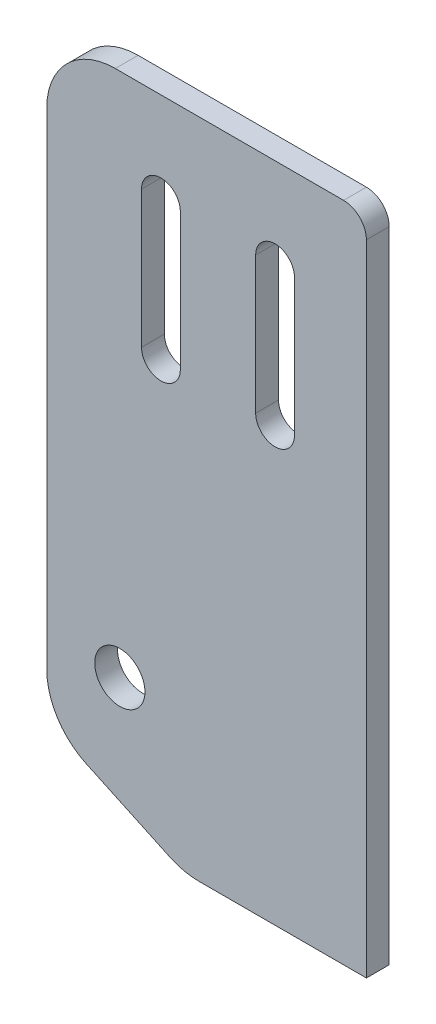
ISO-10303-21;
HEADER;
FILE_DESCRIPTION(('STEP AP214'),'2;1');
FILE_NAME('part.step','',(''),(''),'','','');
FILE_SCHEMA(('AUTOMOTIVE_DESIGN { 1 0 10303 214 1 1 1 1 }'));
ENDSEC;
DATA;
#1=APPLICATION_CONTEXT('core data for automotive mechanical design processes');
#2=APPLICATION_PROTOCOL_DEFINITION('international standard','automotive_design',2000,#1);
#3=PRODUCT_CONTEXT('',#1,'mechanical');
#4=PRODUCT('Part','Part','',(#3));
#5=PRODUCT_RELATED_PRODUCT_CATEGORY('part','',(#4));
#6=PRODUCT_DEFINITION_FORMATION('','',#4);
#7=PRODUCT_DEFINITION_CONTEXT('part definition',#1,'design');
#8=PRODUCT_DEFINITION('design','',#6,#7);
#9=PRODUCT_DEFINITION_SHAPE('','',#8);
#10=(LENGTH_UNIT() NAMED_UNIT(*) SI_UNIT(.MILLI.,.METRE.));
#11=(NAMED_UNIT(*) PLANE_ANGLE_UNIT() SI_UNIT($,.RADIAN.));
#12=(NAMED_UNIT(*) SI_UNIT($,.STERADIAN.) SOLID_ANGLE_UNIT());
#13=UNCERTAINTY_MEASURE_WITH_UNIT(LENGTH_MEASURE(1.E-05),#10,'distance_accuracy_value','');
#14=(GEOMETRIC_REPRESENTATION_CONTEXT(3) GLOBAL_UNCERTAINTY_ASSIGNED_CONTEXT((#13)) GLOBAL_UNIT_ASSIGNED_CONTEXT((#10,
#11,#12)) REPRESENTATION_CONTEXT('',''));
#15=CARTESIAN_POINT('',(0.,0.,0.));
#16=DIRECTION('',(0.,0.,1.));
#17=DIRECTION('',(1.,0.,0.));
#18=AXIS2_PLACEMENT_3D('',#15,#16,#17);
#19=CARTESIAN_POINT('',(0.,-145.,-5.));
#20=DIRECTION('',(-1.,0.,0.));
#21=DIRECTION('',(0.,0.,1.));
#22=AXIS2_PLACEMENT_3D('',#19,#20,#21);
#23=PLANE('',#22);
#24=DIRECTION('',(0.,-1.,0.));
#25=VECTOR('',#24,1.);
#26=CARTESIAN_POINT('',(0.,-145.,-5.));
#27=LINE('',#26,#25);
#28=CARTESIAN_POINT('',(0.,-15.,-5.));
#29=VERTEX_POINT('',#28);
#30=CARTESIAN_POINT('',(0.,-121.454716343238,-5.));
#31=VERTEX_POINT('',#30);
#32=EDGE_CURVE('E238',#29,#31,#27,.T.);
#33=ORIENTED_EDGE('',*,*,#32,.T.);
#34=DIRECTION('',(0.,0.,-1.));
#35=VECTOR('',#34,1.);
#36=CARTESIAN_POINT('',(0.,-121.454716343238,-5.));
#37=LINE('',#36,#35);
#38=CARTESIAN_POINT('',(0.,-121.454716343238,0.));
#39=VERTEX_POINT('',#38);
#40=EDGE_CURVE('E287',#31,#39,#37,.F.);
#41=ORIENTED_EDGE('',*,*,#40,.T.);
#42=DIRECTION('',(0.,-1.,0.));
#43=VECTOR('',#42,1.);
#44=CARTESIAN_POINT('',(0.,-145.,0.));
#45=LINE('',#44,#43);
#46=CARTESIAN_POINT('',(0.,-15.,0.));
#47=VERTEX_POINT('',#46);
#48=EDGE_CURVE('E237',#47,#39,#45,.T.);
#49=ORIENTED_EDGE('',*,*,#48,.F.);
#50=DIRECTION('',(0.,0.,1.));
#51=VECTOR('',#50,1.);
#52=CARTESIAN_POINT('',(0.,-15.,-5.));
#53=LINE('',#52,#51);
#54=EDGE_CURVE('E285',#47,#29,#53,.F.);
#55=ORIENTED_EDGE('',*,*,#54,.T.);
#56=EDGE_LOOP('',(#33,#41,#49,#55));
#57=FACE_BOUND('',#56,.T.);
#58=ADVANCED_FACE('F45',(#57),#23,.T.);
#59=CARTESIAN_POINT('',(0.,0.,-5.));
#60=DIRECTION('',(0.,1.,0.));
#61=DIRECTION('',(0.,0.,1.));
#62=AXIS2_PLACEMENT_3D('',#59,#60,#61);
#63=PLANE('',#62);
#64=DIRECTION('',(-1.,0.,0.));
#65=VECTOR('',#64,1.);
#66=CARTESIAN_POINT('',(0.,0.,0.));
#67=LINE('',#66,#65);
#68=CARTESIAN_POINT('',(65.,0.,0.));
#69=VERTEX_POINT('',#68);
#70=CARTESIAN_POINT('',(15.,0.,0.));
#71=VERTEX_POINT('',#70);
#72=EDGE_CURVE('E242',#69,#71,#67,.T.);
#73=ORIENTED_EDGE('',*,*,#72,.F.);
#74=DIRECTION('',(0.,0.,1.));
#75=VECTOR('',#74,1.);
#76=CARTESIAN_POINT('',(65.,0.,-5.));
#77=LINE('',#76,#75);
#78=CARTESIAN_POINT('',(65.,0.,-5.));
#79=VERTEX_POINT('',#78);
#80=EDGE_CURVE('E53',#69,#79,#77,.F.);
#81=ORIENTED_EDGE('',*,*,#80,.T.);
#82=DIRECTION('',(-1.,0.,0.));
#83=VECTOR('',#82,1.);
#84=CARTESIAN_POINT('',(0.,0.,-5.));
#85=LINE('',#84,#83);
#86=CARTESIAN_POINT('',(15.,0.,-5.));
#87=VERTEX_POINT('',#86);
#88=EDGE_CURVE('E247',#79,#87,#85,.T.);
#89=ORIENTED_EDGE('',*,*,#88,.T.);
#90=DIRECTION('',(0.,0.,1.));
#91=VECTOR('',#90,1.);
#92=CARTESIAN_POINT('',(15.,0.,-5.));
#93=LINE('',#92,#91);
#94=EDGE_CURVE('E290',#87,#71,#93,.T.);
#95=ORIENTED_EDGE('',*,*,#94,.T.);
#96=EDGE_LOOP('',(#73,#81,#89,#95));
#97=FACE_BOUND('',#96,.T.);
#98=ADVANCED_FACE('F320',(#97),#63,.T.);
#99=CARTESIAN_POINT('',(70.,0.,-5.));
#100=DIRECTION('',(1.,0.,0.));
#101=DIRECTION('',(0.,1.,0.));
#102=AXIS2_PLACEMENT_3D('',#99,#100,#101);
#103=PLANE('',#102);
#104=DIRECTION('',(0.,1.,0.));
#105=VECTOR('',#104,1.);
#106=CARTESIAN_POINT('',(70.,0.,-5.));
#107=LINE('',#106,#105);
#108=CARTESIAN_POINT('',(70.,-145.,-5.));
#109=VERTEX_POINT('',#108);
#110=CARTESIAN_POINT('',(70.,-5.,-5.));
#111=VERTEX_POINT('',#110);
#112=EDGE_CURVE('E244',#109,#111,#107,.T.);
#113=ORIENTED_EDGE('',*,*,#112,.T.);
#114=DIRECTION('',(0.,0.,1.));
#115=VECTOR('',#114,1.);
#116=CARTESIAN_POINT('',(70.,-5.,-5.));
#117=LINE('',#116,#115);
#118=CARTESIAN_POINT('',(70.,-5.,0.));
#119=VERTEX_POINT('',#118);
#120=EDGE_CURVE('E293',#111,#119,#117,.T.);
#121=ORIENTED_EDGE('',*,*,#120,.T.);
#122=DIRECTION('',(0.,1.,0.));
#123=VECTOR('',#122,1.);
#124=CARTESIAN_POINT('',(70.,0.,0.));
#125=LINE('',#124,#123);
#126=CARTESIAN_POINT('',(70.,-145.,0.));
#127=VERTEX_POINT('',#126);
#128=EDGE_CURVE('E254',#127,#119,#125,.T.);
#129=ORIENTED_EDGE('',*,*,#128,.F.);
#130=DIRECTION('',(0.,0.,1.));
#131=VECTOR('',#130,1.);
#132=CARTESIAN_POINT('',(70.,-145.,-5.));
#133=LINE('',#132,#131);
#134=EDGE_CURVE('E249',#109,#127,#133,.T.);
#135=ORIENTED_EDGE('',*,*,#134,.F.);
#136=EDGE_LOOP('',(#113,#121,#129,#135));
#137=FACE_BOUND('',#136,.T.);
#138=ADVANCED_FACE('F299',(#137),#103,.T.);
#139=CARTESIAN_POINT('',(70.,-145.,-5.));
#140=DIRECTION('',(0.,-1.,0.));
#141=DIRECTION('',(0.,0.,-1.));
#142=AXIS2_PLACEMENT_3D('',#139,#140,#141);
#143=PLANE('',#142);
#144=DIRECTION('',(1.,0.,0.));
#145=VECTOR('',#144,1.);
#146=CARTESIAN_POINT('',(70.,-145.,0.));
#147=LINE('',#146,#145);
#148=CARTESIAN_POINT('',(33.3254199396444,-145.,0.));
#149=VERTEX_POINT('',#148);
#150=EDGE_CURVE('E252',#149,#127,#147,.T.);
#151=ORIENTED_EDGE('',*,*,#150,.F.);
#152=DIRECTION('',(0.,0.,1.));
#153=VECTOR('',#152,1.);
#154=CARTESIAN_POINT('',(33.3254199396444,-145.,-5.));
#155=LINE('',#154,#153);
#156=CARTESIAN_POINT('',(33.3254199396444,-145.,-5.));
#157=VERTEX_POINT('',#156);
#158=EDGE_CURVE('E265',#149,#157,#155,.F.);
#159=ORIENTED_EDGE('',*,*,#158,.T.);
#160=DIRECTION('',(1.,0.,0.));
#161=VECTOR('',#160,1.);
#162=CARTESIAN_POINT('',(70.,-145.,-5.));
#163=LINE('',#162,#161);
#164=EDGE_CURVE('E241',#157,#109,#163,.T.);
#165=ORIENTED_EDGE('',*,*,#164,.T.);
#166=ORIENTED_EDGE('',*,*,#134,.T.);
#167=EDGE_LOOP('',(#151,#159,#165,#166));
#168=FACE_BOUND('',#167,.T.);
#169=ADVANCED_FACE('F308',(#168),#143,.T.);
#170=CARTESIAN_POINT('',(0.,0.,-5.));
#171=DIRECTION('',(0.,0.,-1.));
#172=DIRECTION('',(-1.,0.,0.));
#173=AXIS2_PLACEMENT_3D('',#170,#171,#172);
#174=PLANE('',#173);
#175=CARTESIAN_POINT('',(16.,-115.,-5.));
#176=DIRECTION('',(0.,0.,-1.));
#177=DIRECTION('',(-1.,0.,0.));
#178=AXIS2_PLACEMENT_3D('',#175,#176,#177);
#179=CIRCLE('',#178,5.5);
#180=CARTESIAN_POINT('',(10.5,-115.,-5.));
#181=VERTEX_POINT('',#180);
#182=EDGE_CURVE('E234',#181,#181,#179,.T.);
#183=ORIENTED_EDGE('',*,*,#182,.F.);
#184=EDGE_LOOP('',(#183));
#185=FACE_BOUND('',#184,.T.);
#186=CARTESIAN_POINT('',(50.,-20.,-5.));
#187=DIRECTION('',(0.,0.,-1.));
#188=DIRECTION('',(-1.,0.,0.));
#189=AXIS2_PLACEMENT_3D('',#186,#187,#188);
#190=CIRCLE('',#189,4.25000000000001);
#191=CARTESIAN_POINT('',(45.75,-20.,-5.));
#192=VERTEX_POINT('',#191);
#193=CARTESIAN_POINT('',(54.25,-20.,-5.));
#194=VERTEX_POINT('',#193);
#195=EDGE_CURVE('E232',#192,#194,#190,.T.);
#196=ORIENTED_EDGE('',*,*,#195,.F.);
#197=DIRECTION('',(0.,1.,0.));
#198=VECTOR('',#197,1.);
#199=CARTESIAN_POINT('',(45.75,0.,-5.));
#200=LINE('',#199,#198);
#201=CARTESIAN_POINT('',(45.75,-50.,-5.));
#202=VERTEX_POINT('',#201);
#203=EDGE_CURVE('E227',#202,#192,#200,.T.);
#204=ORIENTED_EDGE('',*,*,#203,.F.);
#205=CARTESIAN_POINT('',(50.,-50.,-5.));
#206=DIRECTION('',(0.,0.,-1.));
#207=DIRECTION('',(-1.,0.,0.));
#208=AXIS2_PLACEMENT_3D('',#205,#206,#207);
#209=CIRCLE('',#208,4.25000000000001);
#210=CARTESIAN_POINT('',(54.25,-50.,-5.));
#211=VERTEX_POINT('',#210);
#212=EDGE_CURVE('E170',#211,#202,#209,.T.);
#213=ORIENTED_EDGE('',*,*,#212,.F.);
#214=DIRECTION('',(0.,-1.,0.));
#215=VECTOR('',#214,1.);
#216=CARTESIAN_POINT('',(54.25,0.,-5.));
#217=LINE('',#216,#215);
#218=EDGE_CURVE('E230',#194,#211,#217,.T.);
#219=ORIENTED_EDGE('',*,*,#218,.F.);
#220=EDGE_LOOP('',(#196,#204,#213,#219));
#221=FACE_BOUND('',#220,.T.);
#222=CARTESIAN_POINT('',(25.,-20.,-5.));
#223=DIRECTION('',(0.,0.,-1.));
#224=DIRECTION('',(-1.,0.,0.));
#225=AXIS2_PLACEMENT_3D('',#222,#223,#224);
#226=CIRCLE('',#225,4.25000000000001);
#227=CARTESIAN_POINT('',(20.75,-20.,-5.));
#228=VERTEX_POINT('',#227);
#229=CARTESIAN_POINT('',(29.25,-20.,-5.));
#230=VERTEX_POINT('',#229);
#231=EDGE_CURVE('E225',#228,#230,#226,.T.);
#232=ORIENTED_EDGE('',*,*,#231,.F.);
#233=DIRECTION('',(0.,1.,0.));
#234=VECTOR('',#233,1.);
#235=CARTESIAN_POINT('',(20.75,0.,-5.));
#236=LINE('',#235,#234);
#237=CARTESIAN_POINT('',(20.75,-50.,-5.));
#238=VERTEX_POINT('',#237);
#239=EDGE_CURVE('E218',#238,#228,#236,.T.);
#240=ORIENTED_EDGE('',*,*,#239,.F.);
#241=CARTESIAN_POINT('',(25.,-50.,-5.));
#242=DIRECTION('',(0.,0.,-1.));
#243=DIRECTION('',(-1.,0.,0.));
#244=AXIS2_PLACEMENT_3D('',#241,#242,#243);
#245=CIRCLE('',#244,4.25000000000001);
#246=CARTESIAN_POINT('',(29.25,-50.,-5.));
#247=VERTEX_POINT('',#246);
#248=EDGE_CURVE('E220',#247,#238,#245,.T.);
#249=ORIENTED_EDGE('',*,*,#248,.F.);
#250=DIRECTION('',(0.,-1.,0.));
#251=VECTOR('',#250,1.);
#252=CARTESIAN_POINT('',(29.25,0.,-5.));
#253=LINE('',#252,#251);
#254=EDGE_CURVE('E223',#230,#247,#253,.T.);
#255=ORIENTED_EDGE('',*,*,#254,.F.);
#256=EDGE_LOOP('',(#232,#240,#249,#255));
#257=FACE_BOUND('',#256,.T.);
#258=ORIENTED_EDGE('',*,*,#88,.F.);
#259=CARTESIAN_POINT('',(65.,-5.,-5.));
#260=DIRECTION('',(0.,0.,-1.));
#261=DIRECTION('',(-1.,0.,0.));
#262=AXIS2_PLACEMENT_3D('',#259,#260,#261);
#263=CIRCLE('',#262,5.);
#264=EDGE_CURVE('E11',#79,#111,#263,.T.);
#265=ORIENTED_EDGE('',*,*,#264,.T.);
#266=ORIENTED_EDGE('',*,*,#112,.F.);
#267=ORIENTED_EDGE('',*,*,#164,.F.);
#268=CARTESIAN_POINT('',(33.3254199396444,-130.,-5.));
#269=DIRECTION('',(0.,0.,-1.));
#270=DIRECTION('',(-1.,0.,0.));
#271=AXIS2_PLACEMENT_3D('',#268,#269,#270);
#272=CIRCLE('',#271,15.);
#273=CARTESIAN_POINT('',(26.9861460135339,-143.59461680555,-5.));
#274=VERTEX_POINT('',#273);
#275=EDGE_CURVE('E273',#157,#274,#272,.T.);
#276=ORIENTED_EDGE('',*,*,#275,.T.);
#277=DIRECTION('',(0.906307787036651,-0.422618261740697,0.));
#278=VECTOR('',#277,1.);
#279=CARTESIAN_POINT('',(-50.1800362714238,-107.61143505549,-5.));
#280=LINE('',#279,#278);
#281=CARTESIAN_POINT('',(8.66072607388955,-135.049333148787,-5.));
#282=VERTEX_POINT('',#281);
#283=EDGE_CURVE('E262',#274,#282,#280,.F.);
#284=ORIENTED_EDGE('',*,*,#283,.T.);
#285=CARTESIAN_POINT('',(15.,-121.454716343238,-5.));
#286=DIRECTION('',(0.,0.,-1.));
#287=DIRECTION('',(-1.,0.,0.));
#288=AXIS2_PLACEMENT_3D('',#285,#286,#287);
#289=CIRCLE('',#288,15.);
#290=EDGE_CURVE('E271',#282,#31,#289,.T.);
#291=ORIENTED_EDGE('',*,*,#290,.T.);
#292=ORIENTED_EDGE('',*,*,#32,.F.);
#293=CARTESIAN_POINT('',(15.,-15.,-5.));
#294=DIRECTION('',(0.,0.,-1.));
#295=DIRECTION('',(-1.,0.,0.));
#296=AXIS2_PLACEMENT_3D('',#293,#294,#295);
#297=CIRCLE('',#296,15.);
#298=EDGE_CURVE('E268',#29,#87,#297,.T.);
#299=ORIENTED_EDGE('',*,*,#298,.T.);
#300=EDGE_LOOP('',(#258,#265,#266,#267,#276,#284,#291,#292,#299));
#301=FACE_BOUND('',#300,.T.);
#302=ADVANCED_FACE('F311',(#185,#221,#257,#301),#174,.T.);
#303=CARTESIAN_POINT('',(0.,0.,0.));
#304=DIRECTION('',(0.,0.,-1.));
#305=DIRECTION('',(-1.,0.,0.));
#306=AXIS2_PLACEMENT_3D('',#303,#304,#305);
#307=PLANE('',#306);
#308=CARTESIAN_POINT('',(16.,-115.,0.));
#309=DIRECTION('',(0.,0.,1.));
#310=DIRECTION('',(1.,0.,0.));
#311=AXIS2_PLACEMENT_3D('',#308,#309,#310);
#312=CIRCLE('',#311,5.5);
#313=CARTESIAN_POINT('',(21.5,-115.,0.));
#314=VERTEX_POINT('',#313);
#315=EDGE_CURVE('E195',#314,#314,#312,.T.);
#316=ORIENTED_EDGE('',*,*,#315,.F.);
#317=EDGE_LOOP('',(#316));
#318=FACE_BOUND('',#317,.T.);
#319=DIRECTION('',(0.,-1.,0.));
#320=VECTOR('',#319,1.);
#321=CARTESIAN_POINT('',(45.75,-20.,0.));
#322=LINE('',#321,#320);
#323=CARTESIAN_POINT('',(45.75,-20.,0.));
#324=VERTEX_POINT('',#323);
#325=CARTESIAN_POINT('',(45.75,-50.,0.));
#326=VERTEX_POINT('',#325);
#327=EDGE_CURVE('E178',#324,#326,#322,.T.);
#328=ORIENTED_EDGE('',*,*,#327,.F.);
#329=CARTESIAN_POINT('',(50.,-20.,0.));
#330=DIRECTION('',(0.,0.,1.));
#331=DIRECTION('',(1.,0.,0.));
#332=AXIS2_PLACEMENT_3D('',#329,#330,#331);
#333=CIRCLE('',#332,4.25000000000001);
#334=CARTESIAN_POINT('',(54.25,-20.,0.));
#335=VERTEX_POINT('',#334);
#336=EDGE_CURVE('E183',#335,#324,#333,.T.);
#337=ORIENTED_EDGE('',*,*,#336,.F.);
#338=DIRECTION('',(0.,1.,0.));
#339=VECTOR('',#338,1.);
#340=CARTESIAN_POINT('',(54.25,-20.,0.));
#341=LINE('',#340,#339);
#342=CARTESIAN_POINT('',(54.25,-50.,0.));
#343=VERTEX_POINT('',#342);
#344=EDGE_CURVE('E188',#343,#335,#341,.T.);
#345=ORIENTED_EDGE('',*,*,#344,.F.);
#346=CARTESIAN_POINT('',(50.,-50.,0.));
#347=DIRECTION('',(0.,0.,1.));
#348=DIRECTION('',(1.,0.,0.));
#349=AXIS2_PLACEMENT_3D('',#346,#347,#348);
#350=CIRCLE('',#349,4.25000000000001);
#351=EDGE_CURVE('E167',#326,#343,#350,.T.);
#352=ORIENTED_EDGE('',*,*,#351,.F.);
#353=EDGE_LOOP('',(#328,#337,#345,#352));
#354=FACE_BOUND('',#353,.T.);
#355=DIRECTION('',(0.,-1.,0.));
#356=VECTOR('',#355,1.);
#357=CARTESIAN_POINT('',(20.75,-20.,0.));
#358=LINE('',#357,#356);
#359=CARTESIAN_POINT('',(20.75,-20.,0.));
#360=VERTEX_POINT('',#359);
#361=CARTESIAN_POINT('',(20.75,-50.,0.));
#362=VERTEX_POINT('',#361);
#363=EDGE_CURVE('E200',#360,#362,#358,.T.);
#364=ORIENTED_EDGE('',*,*,#363,.F.);
#365=CARTESIAN_POINT('',(25.,-20.,0.));
#366=DIRECTION('',(0.,0.,1.));
#367=DIRECTION('',(1.,0.,0.));
#368=AXIS2_PLACEMENT_3D('',#365,#366,#367);
#369=CIRCLE('',#368,4.25000000000001);
#370=CARTESIAN_POINT('',(29.25,-20.,0.));
#371=VERTEX_POINT('',#370);
#372=EDGE_CURVE('E198',#371,#360,#369,.T.);
#373=ORIENTED_EDGE('',*,*,#372,.F.);
#374=DIRECTION('',(0.,1.,0.));
#375=VECTOR('',#374,1.);
#376=CARTESIAN_POINT('',(29.25,-20.,0.));
#377=LINE('',#376,#375);
#378=CARTESIAN_POINT('',(29.25,-50.,0.));
#379=VERTEX_POINT('',#378);
#380=EDGE_CURVE('E206',#379,#371,#377,.T.);
#381=ORIENTED_EDGE('',*,*,#380,.F.);
#382=CARTESIAN_POINT('',(25.,-50.,0.));
#383=DIRECTION('',(0.,0.,1.));
#384=DIRECTION('',(1.,0.,0.));
#385=AXIS2_PLACEMENT_3D('',#382,#383,#384);
#386=CIRCLE('',#385,4.25000000000001);
#387=EDGE_CURVE('E203',#362,#379,#386,.T.);
#388=ORIENTED_EDGE('',*,*,#387,.F.);
#389=EDGE_LOOP('',(#364,#373,#381,#388));
#390=FACE_BOUND('',#389,.T.);
#391=ORIENTED_EDGE('',*,*,#128,.T.);
#392=CARTESIAN_POINT('',(65.,-5.,0.));
#393=DIRECTION('',(0.,0.,-1.));
#394=DIRECTION('',(-1.,0.,0.));
#395=AXIS2_PLACEMENT_3D('',#392,#393,#394);
#396=CIRCLE('',#395,5.);
#397=EDGE_CURVE('E67',#119,#69,#396,.F.);
#398=ORIENTED_EDGE('',*,*,#397,.T.);
#399=ORIENTED_EDGE('',*,*,#72,.T.);
#400=CARTESIAN_POINT('',(15.,-15.,0.));
#401=DIRECTION('',(0.,0.,-1.));
#402=DIRECTION('',(-1.,0.,0.));
#403=AXIS2_PLACEMENT_3D('',#400,#401,#402);
#404=CIRCLE('',#403,15.);
#405=EDGE_CURVE('E279',#71,#47,#404,.F.);
#406=ORIENTED_EDGE('',*,*,#405,.T.);
#407=ORIENTED_EDGE('',*,*,#48,.T.);
#408=CARTESIAN_POINT('',(15.,-121.454716343238,0.));
#409=DIRECTION('',(0.,0.,-1.));
#410=DIRECTION('',(-1.,0.,0.));
#411=AXIS2_PLACEMENT_3D('',#408,#409,#410);
#412=CIRCLE('',#411,15.);
#413=CARTESIAN_POINT('',(8.66072607388955,-135.049333148787,0.));
#414=VERTEX_POINT('',#413);
#415=EDGE_CURVE('E281',#39,#414,#412,.F.);
#416=ORIENTED_EDGE('',*,*,#415,.T.);
#417=DIRECTION('',(-0.906307787036651,0.422618261740697,0.));
#418=VECTOR('',#417,1.);
#419=CARTESIAN_POINT('',(0.,-131.01077025535,0.));
#420=LINE('',#419,#418);
#421=CARTESIAN_POINT('',(26.9861460135339,-143.59461680555,0.));
#422=VERTEX_POINT('',#421);
#423=EDGE_CURVE('E259',#414,#422,#420,.F.);
#424=ORIENTED_EDGE('',*,*,#423,.T.);
#425=CARTESIAN_POINT('',(33.3254199396444,-130.,0.));
#426=DIRECTION('',(0.,0.,-1.));
#427=DIRECTION('',(-1.,0.,0.));
#428=AXIS2_PLACEMENT_3D('',#425,#426,#427);
#429=CIRCLE('',#428,15.);
#430=EDGE_CURVE('E283',#422,#149,#429,.F.);
#431=ORIENTED_EDGE('',*,*,#430,.T.);
#432=ORIENTED_EDGE('',*,*,#150,.T.);
#433=EDGE_LOOP('',(#391,#398,#399,#406,#407,#416,#424,#431,#432));
#434=FACE_BOUND('',#433,.T.);
#435=ADVANCED_FACE('F185',(#318,#354,#390,#434),#307,.F.);
#436=CARTESIAN_POINT('',(25.,-20.,-10.));
#437=DIRECTION('',(0.,0.,1.));
#438=DIRECTION('',(1.,0.,0.));
#439=AXIS2_PLACEMENT_3D('',#436,#437,#438);
#440=CYLINDRICAL_SURFACE('',#439,4.25000000000001);
#441=ORIENTED_EDGE('',*,*,#231,.T.);
#442=DIRECTION('',(0.,0.,1.));
#443=VECTOR('',#442,1.);
#444=CARTESIAN_POINT('',(29.25,-20.,-10.));
#445=LINE('',#444,#443);
#446=EDGE_CURVE('E210',#230,#371,#445,.T.);
#447=ORIENTED_EDGE('',*,*,#446,.T.);
#448=ORIENTED_EDGE('',*,*,#372,.T.);
#449=DIRECTION('',(0.,0.,1.));
#450=VECTOR('',#449,1.);
#451=CARTESIAN_POINT('',(20.75,-20.,-10.));
#452=LINE('',#451,#450);
#453=EDGE_CURVE('E209',#228,#360,#452,.T.);
#454=ORIENTED_EDGE('',*,*,#453,.F.);
#455=EDGE_LOOP('',(#441,#447,#448,#454));
#456=FACE_BOUND('',#455,.T.);
#457=ADVANCED_FACE('F402',(#456),#440,.F.);
#458=CARTESIAN_POINT('',(29.25,-20.,-10.));
#459=DIRECTION('',(1.,0.,0.));
#460=DIRECTION('',(0.,0.,-1.));
#461=AXIS2_PLACEMENT_3D('',#458,#459,#460);
#462=PLANE('',#461);
#463=ORIENTED_EDGE('',*,*,#254,.T.);
#464=DIRECTION('',(0.,0.,1.));
#465=VECTOR('',#464,1.);
#466=CARTESIAN_POINT('',(29.25,-50.,-10.));
#467=LINE('',#466,#465);
#468=EDGE_CURVE('E212',#247,#379,#467,.T.);
#469=ORIENTED_EDGE('',*,*,#468,.T.);
#470=ORIENTED_EDGE('',*,*,#380,.T.);
#471=ORIENTED_EDGE('',*,*,#446,.F.);
#472=EDGE_LOOP('',(#463,#469,#470,#471));
#473=FACE_BOUND('',#472,.T.);
#474=ADVANCED_FACE('F493',(#473),#462,.F.);
#475=CARTESIAN_POINT('',(25.,-50.,-10.));
#476=DIRECTION('',(0.,0.,1.));
#477=DIRECTION('',(1.,0.,0.));
#478=AXIS2_PLACEMENT_3D('',#475,#476,#477);
#479=CYLINDRICAL_SURFACE('',#478,4.25000000000001);
#480=ORIENTED_EDGE('',*,*,#248,.T.);
#481=DIRECTION('',(0.,0.,1.));
#482=VECTOR('',#481,1.);
#483=CARTESIAN_POINT('',(20.75,-50.,-10.));
#484=LINE('',#483,#482);
#485=EDGE_CURVE('E214',#238,#362,#484,.T.);
#486=ORIENTED_EDGE('',*,*,#485,.T.);
#487=ORIENTED_EDGE('',*,*,#387,.T.);
#488=ORIENTED_EDGE('',*,*,#468,.F.);
#489=EDGE_LOOP('',(#480,#486,#487,#488));
#490=FACE_BOUND('',#489,.T.);
#491=ADVANCED_FACE('F483',(#490),#479,.F.);
#492=CARTESIAN_POINT('',(20.75,-20.,-10.));
#493=DIRECTION('',(-1.,0.,0.));
#494=DIRECTION('',(0.,0.,1.));
#495=AXIS2_PLACEMENT_3D('',#492,#493,#494);
#496=PLANE('',#495);
#497=ORIENTED_EDGE('',*,*,#239,.T.);
#498=ORIENTED_EDGE('',*,*,#453,.T.);
#499=ORIENTED_EDGE('',*,*,#363,.T.);
#500=ORIENTED_EDGE('',*,*,#485,.F.);
#501=EDGE_LOOP('',(#497,#498,#499,#500));
#502=FACE_BOUND('',#501,.T.);
#503=ADVANCED_FACE('F473',(#502),#496,.F.);
#504=CARTESIAN_POINT('',(50.,-20.,-10.));
#505=DIRECTION('',(0.,0.,1.));
#506=DIRECTION('',(1.,0.,0.));
#507=AXIS2_PLACEMENT_3D('',#504,#505,#506);
#508=CYLINDRICAL_SURFACE('',#507,4.25000000000001);
#509=ORIENTED_EDGE('',*,*,#195,.T.);
#510=DIRECTION('',(0.,0.,1.));
#511=VECTOR('',#510,1.);
#512=CARTESIAN_POINT('',(54.25,-20.,-10.));
#513=LINE('',#512,#511);
#514=EDGE_CURVE('E193',#194,#335,#513,.T.);
#515=ORIENTED_EDGE('',*,*,#514,.T.);
#516=ORIENTED_EDGE('',*,*,#336,.T.);
#517=DIRECTION('',(0.,0.,1.));
#518=VECTOR('',#517,1.);
#519=CARTESIAN_POINT('',(45.75,-20.,-10.));
#520=LINE('',#519,#518);
#521=EDGE_CURVE('E174',#192,#324,#520,.T.);
#522=ORIENTED_EDGE('',*,*,#521,.F.);
#523=EDGE_LOOP('',(#509,#515,#516,#522));
#524=FACE_BOUND('',#523,.T.);
#525=ADVANCED_FACE('F463',(#524),#508,.F.);
#526=CARTESIAN_POINT('',(54.25,-20.,-10.));
#527=DIRECTION('',(1.,0.,0.));
#528=DIRECTION('',(0.,0.,-1.));
#529=AXIS2_PLACEMENT_3D('',#526,#527,#528);
#530=PLANE('',#529);
#531=ORIENTED_EDGE('',*,*,#218,.T.);
#532=DIRECTION('',(0.,0.,1.));
#533=VECTOR('',#532,1.);
#534=CARTESIAN_POINT('',(54.25,-50.,-10.));
#535=LINE('',#534,#533);
#536=EDGE_CURVE('E173',#211,#343,#535,.T.);
#537=ORIENTED_EDGE('',*,*,#536,.T.);
#538=ORIENTED_EDGE('',*,*,#344,.T.);
#539=ORIENTED_EDGE('',*,*,#514,.F.);
#540=EDGE_LOOP('',(#531,#537,#538,#539));
#541=FACE_BOUND('',#540,.T.);
#542=ADVANCED_FACE('F454',(#541),#530,.F.);
#543=CARTESIAN_POINT('',(50.,-50.,-10.));
#544=DIRECTION('',(0.,0.,1.));
#545=DIRECTION('',(1.,0.,0.));
#546=AXIS2_PLACEMENT_3D('',#543,#544,#545);
#547=CYLINDRICAL_SURFACE('',#546,4.25000000000001);
#548=ORIENTED_EDGE('',*,*,#212,.T.);
#549=DIRECTION('',(0.,0.,1.));
#550=VECTOR('',#549,1.);
#551=CARTESIAN_POINT('',(45.75,-50.,-10.));
#552=LINE('',#551,#550);
#553=EDGE_CURVE('E162',#202,#326,#552,.T.);
#554=ORIENTED_EDGE('',*,*,#553,.T.);
#555=ORIENTED_EDGE('',*,*,#351,.T.);
#556=ORIENTED_EDGE('',*,*,#536,.F.);
#557=EDGE_LOOP('',(#548,#554,#555,#556));
#558=FACE_BOUND('',#557,.T.);
#559=ADVANCED_FACE('F164',(#558),#547,.F.);
#560=CARTESIAN_POINT('',(45.75,-20.,-10.));
#561=DIRECTION('',(-1.,0.,0.));
#562=DIRECTION('',(0.,0.,1.));
#563=AXIS2_PLACEMENT_3D('',#560,#561,#562);
#564=PLANE('',#563);
#565=ORIENTED_EDGE('',*,*,#203,.T.);
#566=ORIENTED_EDGE('',*,*,#521,.T.);
#567=ORIENTED_EDGE('',*,*,#327,.T.);
#568=ORIENTED_EDGE('',*,*,#553,.F.);
#569=EDGE_LOOP('',(#565,#566,#567,#568));
#570=FACE_BOUND('',#569,.T.);
#571=ADVANCED_FACE('F179',(#570),#564,.F.);
#572=CARTESIAN_POINT('',(16.,-115.,-10.));
#573=DIRECTION('',(0.,0.,1.));
#574=DIRECTION('',(1.,0.,0.));
#575=AXIS2_PLACEMENT_3D('',#572,#573,#574);
#576=CYLINDRICAL_SURFACE('',#575,5.5);
#577=ORIENTED_EDGE('',*,*,#182,.T.);
#578=EDGE_LOOP('',(#577));
#579=FACE_BOUND('',#578,.T.);
#580=ORIENTED_EDGE('',*,*,#315,.T.);
#581=EDGE_LOOP('',(#580));
#582=FACE_BOUND('',#581,.T.);
#583=ADVANCED_FACE('F337',(#579,#582),#576,.F.);
#584=CARTESIAN_POINT('',(0.,-131.01077025535,-5.));
#585=DIRECTION('',(0.422618261740697,0.906307787036651,0.));
#586=DIRECTION('',(0.,0.,1.));
#587=AXIS2_PLACEMENT_3D('',#584,#585,#586);
#588=PLANE('',#587);
#589=ORIENTED_EDGE('',*,*,#283,.F.);
#590=DIRECTION('',(0.,0.,-1.));
#591=VECTOR('',#590,1.);
#592=CARTESIAN_POINT('',(26.9861460135339,-143.59461680555,-5.));
#593=LINE('',#592,#591);
#594=EDGE_CURVE('E277',#274,#422,#593,.F.);
#595=ORIENTED_EDGE('',*,*,#594,.T.);
#596=ORIENTED_EDGE('',*,*,#423,.F.);
#597=DIRECTION('',(0.,0.,1.));
#598=VECTOR('',#597,1.);
#599=CARTESIAN_POINT('',(8.66072607388955,-135.049333148787,-5.));
#600=LINE('',#599,#598);
#601=EDGE_CURVE('E275',#414,#282,#600,.F.);
#602=ORIENTED_EDGE('',*,*,#601,.T.);
#603=EDGE_LOOP('',(#589,#595,#596,#602));
#604=FACE_BOUND('',#603,.T.);
#605=ADVANCED_FACE('F331',(#604),#588,.F.);
#606=CARTESIAN_POINT('',(33.3254199396444,-130.,-5.));
#607=DIRECTION('',(0.,0.,1.));
#608=DIRECTION('',(1.,0.,0.));
#609=AXIS2_PLACEMENT_3D('',#606,#607,#608);
#610=CYLINDRICAL_SURFACE('',#609,15.);
#611=ORIENTED_EDGE('',*,*,#430,.F.);
#612=ORIENTED_EDGE('',*,*,#594,.F.);
#613=ORIENTED_EDGE('',*,*,#275,.F.);
#614=ORIENTED_EDGE('',*,*,#158,.F.);
#615=EDGE_LOOP('',(#611,#612,#613,#614));
#616=FACE_BOUND('',#615,.T.);
#617=ADVANCED_FACE('F336',(#616),#610,.T.);
#618=CARTESIAN_POINT('',(15.,-121.454716343238,-5.));
#619=DIRECTION('',(0.,0.,-1.));
#620=DIRECTION('',(-1.,0.,0.));
#621=AXIS2_PLACEMENT_3D('',#618,#619,#620);
#622=CYLINDRICAL_SURFACE('',#621,15.);
#623=ORIENTED_EDGE('',*,*,#290,.F.);
#624=ORIENTED_EDGE('',*,*,#601,.F.);
#625=ORIENTED_EDGE('',*,*,#415,.F.);
#626=ORIENTED_EDGE('',*,*,#40,.F.);
#627=EDGE_LOOP('',(#623,#624,#625,#626));
#628=FACE_BOUND('',#627,.T.);
#629=ADVANCED_FACE('F317',(#628),#622,.T.);
#630=CARTESIAN_POINT('',(15.,-15.,-5.));
#631=DIRECTION('',(0.,0.,1.));
#632=DIRECTION('',(1.,0.,0.));
#633=AXIS2_PLACEMENT_3D('',#630,#631,#632);
#634=CYLINDRICAL_SURFACE('',#633,15.);
#635=ORIENTED_EDGE('',*,*,#298,.F.);
#636=ORIENTED_EDGE('',*,*,#54,.F.);
#637=ORIENTED_EDGE('',*,*,#405,.F.);
#638=ORIENTED_EDGE('',*,*,#94,.F.);
#639=EDGE_LOOP('',(#635,#636,#637,#638));
#640=FACE_BOUND('',#639,.T.);
#641=ADVANCED_FACE('F313',(#640),#634,.T.);
#642=CARTESIAN_POINT('',(65.,-5.,-5.));
#643=DIRECTION('',(0.,0.,1.));
#644=DIRECTION('',(1.,0.,0.));
#645=AXIS2_PLACEMENT_3D('',#642,#643,#644);
#646=CYLINDRICAL_SURFACE('',#645,5.);
#647=ORIENTED_EDGE('',*,*,#264,.F.);
#648=ORIENTED_EDGE('',*,*,#80,.F.);
#649=ORIENTED_EDGE('',*,*,#397,.F.);
#650=ORIENTED_EDGE('',*,*,#120,.F.);
#651=EDGE_LOOP('',(#647,#648,#649,#650));
#652=FACE_BOUND('',#651,.T.);
#653=ADVANCED_FACE('F47',(#652),#646,.T.);
#654=CLOSED_SHELL('',(#58,#98,#138,#169,#302,#435,#457,#474,#491,#503,#525,#542,#559,#571,#583,
#605,#617,#629,#641,#653));
#655=MANIFOLD_SOLID_BREP('B2',#654);
#656=ADVANCED_BREP_SHAPE_REPRESENTATION('',(#18,#655),#14);
#657=SHAPE_DEFINITION_REPRESENTATION(#9,#656);
ENDSEC;
END-ISO-10303-21;
